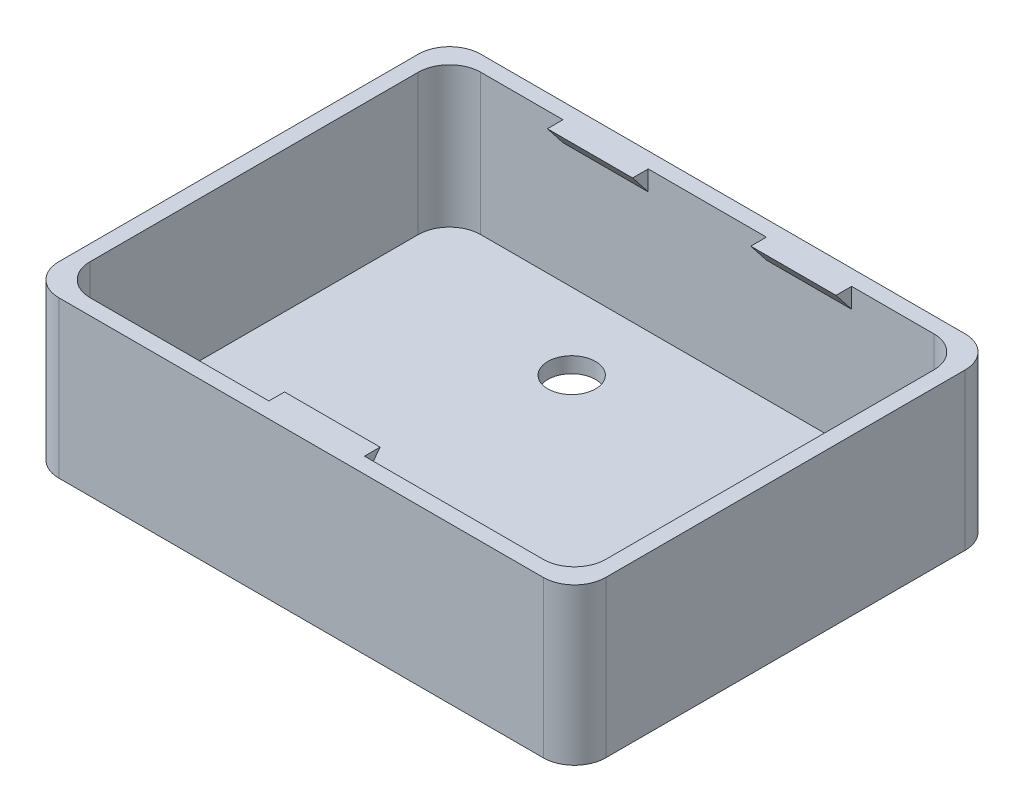
ISO-10303-21;
HEADER;
FILE_DESCRIPTION(('STEP AP214'),'2;1');
FILE_NAME('part.step','',(''),(''),'','','');
FILE_SCHEMA(('AUTOMOTIVE_DESIGN { 1 0 10303 214 1 1 1 1 }'));
ENDSEC;
DATA;
#1=APPLICATION_CONTEXT('core data for automotive mechanical design processes');
#2=APPLICATION_PROTOCOL_DEFINITION('international standard','automotive_design',2000,#1);
#3=PRODUCT_CONTEXT('',#1,'mechanical');
#4=PRODUCT('Part','Part','',(#3));
#5=PRODUCT_RELATED_PRODUCT_CATEGORY('part','',(#4));
#6=PRODUCT_DEFINITION_FORMATION('','',#4);
#7=PRODUCT_DEFINITION_CONTEXT('part definition',#1,'design');
#8=PRODUCT_DEFINITION('design','',#6,#7);
#9=PRODUCT_DEFINITION_SHAPE('','',#8);
#10=(LENGTH_UNIT() NAMED_UNIT(*) SI_UNIT(.MILLI.,.METRE.));
#11=(NAMED_UNIT(*) PLANE_ANGLE_UNIT() SI_UNIT($,.RADIAN.));
#12=(NAMED_UNIT(*) SI_UNIT($,.STERADIAN.) SOLID_ANGLE_UNIT());
#13=UNCERTAINTY_MEASURE_WITH_UNIT(LENGTH_MEASURE(1.E-05),#10,'distance_accuracy_value','');
#14=(GEOMETRIC_REPRESENTATION_CONTEXT(3) GLOBAL_UNCERTAINTY_ASSIGNED_CONTEXT((#13)) GLOBAL_UNIT_ASSIGNED_CONTEXT((#10,
#11,#12)) REPRESENTATION_CONTEXT('',''));
#15=CARTESIAN_POINT('',(0.,0.,0.));
#16=DIRECTION('',(0.,0.,1.));
#17=DIRECTION('',(1.,0.,0.));
#18=AXIS2_PLACEMENT_3D('',#15,#16,#17);
#19=CARTESIAN_POINT('',(16.5,1.,-12.5));
#20=DIRECTION('',(0.,0.,-1.));
#21=DIRECTION('',(-1.,0.,0.));
#22=AXIS2_PLACEMENT_3D('',#19,#20,#21);
#23=PLANE('',#22);
#24=DIRECTION('',(-1.,0.,0.));
#25=VECTOR('',#24,1.);
#26=CARTESIAN_POINT('',(16.5,10.,-12.5));
#27=LINE('',#26,#25);
#28=CARTESIAN_POINT('',(-9.23520923520924,10.,-12.5));
#29=VERTEX_POINT('',#28);
#30=CARTESIAN_POINT('',(-14.5,10.,-12.5));
#31=VERTEX_POINT('',#30);
#32=EDGE_CURVE('E275',#29,#31,#27,.T.);
#33=ORIENTED_EDGE('',*,*,#32,.T.);
#34=DIRECTION('',(0.,1.,0.));
#35=VECTOR('',#34,1.);
#36=CARTESIAN_POINT('',(-14.5,1.,-12.5));
#37=LINE('',#36,#35);
#38=CARTESIAN_POINT('',(-14.5,1.,-12.5));
#39=VERTEX_POINT('',#38);
#40=EDGE_CURVE('E372',#31,#39,#37,.F.);
#41=ORIENTED_EDGE('',*,*,#40,.T.);
#42=DIRECTION('',(-1.,0.,0.));
#43=VECTOR('',#42,1.);
#44=CARTESIAN_POINT('',(16.5,1.,-12.5));
#45=LINE('',#44,#43);
#46=CARTESIAN_POINT('',(14.5,1.,-12.5));
#47=VERTEX_POINT('',#46);
#48=EDGE_CURVE('E259',#47,#39,#45,.T.);
#49=ORIENTED_EDGE('',*,*,#48,.F.);
#50=DIRECTION('',(0.,1.,0.));
#51=VECTOR('',#50,1.);
#52=CARTESIAN_POINT('',(14.5,10.,-12.5));
#53=LINE('',#52,#51);
#54=CARTESIAN_POINT('',(14.5,10.,-12.5));
#55=VERTEX_POINT('',#54);
#56=EDGE_CURVE('E368',#47,#55,#53,.T.);
#57=ORIENTED_EDGE('',*,*,#56,.T.);
#58=CARTESIAN_POINT('',(9.23520923520924,10.,-12.5));
#59=VERTEX_POINT('',#58);
#60=EDGE_CURVE('E251',#55,#59,#27,.T.);
#61=ORIENTED_EDGE('',*,*,#60,.T.);
#62=DIRECTION('',(0.,1.,0.));
#63=VECTOR('',#62,1.);
#64=CARTESIAN_POINT('',(9.23520923520923,10.,-12.5));
#65=LINE('',#64,#63);
#66=CARTESIAN_POINT('',(9.23520923520924,8.72680687641311,-12.5));
#67=VERTEX_POINT('',#66);
#68=EDGE_CURVE('E461',#67,#59,#65,.T.);
#69=ORIENTED_EDGE('',*,*,#68,.F.);
#70=DIRECTION('',(1.,0.,0.));
#71=VECTOR('',#70,1.);
#72=CARTESIAN_POINT('',(9.23520923520924,8.72680687641311,-12.5));
#73=LINE('',#72,#71);
#74=CARTESIAN_POINT('',(3.78134551362898,8.72680687641309,-12.5));
#75=VERTEX_POINT('',#74);
#76=EDGE_CURVE('E472',#75,#67,#73,.T.);
#77=ORIENTED_EDGE('',*,*,#76,.F.);
#78=DIRECTION('',(0.,-1.,0.));
#79=VECTOR('',#78,1.);
#80=CARTESIAN_POINT('',(3.78134551362898,10.,-12.5));
#81=LINE('',#80,#79);
#82=CARTESIAN_POINT('',(3.78134551362898,10.,-12.5));
#83=VERTEX_POINT('',#82);
#84=EDGE_CURVE('E476',#83,#75,#81,.T.);
#85=ORIENTED_EDGE('',*,*,#84,.F.);
#86=CARTESIAN_POINT('',(-3.78134551362898,10.,-12.5));
#87=VERTEX_POINT('',#86);
#88=EDGE_CURVE('E231',#83,#87,#27,.T.);
#89=ORIENTED_EDGE('',*,*,#88,.T.);
#90=DIRECTION('',(0.,1.,0.));
#91=VECTOR('',#90,1.);
#92=CARTESIAN_POINT('',(-3.78134551362898,10.,-12.5));
#93=LINE('',#92,#91);
#94=CARTESIAN_POINT('',(-3.78134551362898,8.72680687641309,-12.5));
#95=VERTEX_POINT('',#94);
#96=EDGE_CURVE('E217',#95,#87,#93,.T.);
#97=ORIENTED_EDGE('',*,*,#96,.F.);
#98=DIRECTION('',(1.,0.,0.));
#99=VECTOR('',#98,1.);
#100=CARTESIAN_POINT('',(-9.23520923520924,8.72680687641309,-12.5));
#101=LINE('',#100,#99);
#102=CARTESIAN_POINT('',(-9.23520923520924,8.72680687641309,-12.5));
#103=VERTEX_POINT('',#102);
#104=EDGE_CURVE('E205',#103,#95,#101,.T.);
#105=ORIENTED_EDGE('',*,*,#104,.F.);
#106=DIRECTION('',(0.,-1.,0.));
#107=VECTOR('',#106,1.);
#108=CARTESIAN_POINT('',(-9.23520923520924,10.,-12.5));
#109=LINE('',#108,#107);
#110=EDGE_CURVE('E218',#29,#103,#109,.T.);
#111=ORIENTED_EDGE('',*,*,#110,.F.);
#112=EDGE_LOOP('',(#33,#41,#49,#57,#61,#69,#77,#85,#89,#97,#105,#111));
#113=FACE_BOUND('',#112,.T.);
#114=ADVANCED_FACE('F39',(#113),#23,.F.);
#115=CARTESIAN_POINT('',(-17.5,10.,13.5));
#116=DIRECTION('',(1.,0.,0.));
#117=DIRECTION('',(0.,0.,-1.));
#118=AXIS2_PLACEMENT_3D('',#115,#116,#117);
#119=PLANE('',#118);
#120=DIRECTION('',(0.,0.,1.));
#121=VECTOR('',#120,1.);
#122=CARTESIAN_POINT('',(-17.5,0.,13.5));
#123=LINE('',#122,#121);
#124=CARTESIAN_POINT('',(-17.5,0.,-11.5));
#125=VERTEX_POINT('',#124);
#126=CARTESIAN_POINT('',(-17.5,0.,11.5));
#127=VERTEX_POINT('',#126);
#128=EDGE_CURVE('E263',#125,#127,#123,.T.);
#129=ORIENTED_EDGE('',*,*,#128,.T.);
#130=DIRECTION('',(0.,-1.,0.));
#131=VECTOR('',#130,1.);
#132=CARTESIAN_POINT('',(-17.5,10.,11.5));
#133=LINE('',#132,#131);
#134=CARTESIAN_POINT('',(-17.5,10.,11.5));
#135=VERTEX_POINT('',#134);
#136=EDGE_CURVE('E358',#127,#135,#133,.F.);
#137=ORIENTED_EDGE('',*,*,#136,.T.);
#138=DIRECTION('',(0.,0.,1.));
#139=VECTOR('',#138,1.);
#140=CARTESIAN_POINT('',(-17.5,10.,13.5));
#141=LINE('',#140,#139);
#142=CARTESIAN_POINT('',(-17.5,10.,-11.5));
#143=VERTEX_POINT('',#142);
#144=EDGE_CURVE('E278',#143,#135,#141,.T.);
#145=ORIENTED_EDGE('',*,*,#144,.F.);
#146=DIRECTION('',(0.,-1.,0.));
#147=VECTOR('',#146,1.);
#148=CARTESIAN_POINT('',(-17.5,10.,-11.5));
#149=LINE('',#148,#147);
#150=EDGE_CURVE('E354',#143,#125,#149,.T.);
#151=ORIENTED_EDGE('',*,*,#150,.T.);
#152=EDGE_LOOP('',(#129,#137,#145,#151));
#153=FACE_BOUND('',#152,.T.);
#154=ADVANCED_FACE('F534',(#153),#119,.F.);
#155=CARTESIAN_POINT('',(17.5,10.,13.5));
#156=DIRECTION('',(0.,0.,-1.));
#157=DIRECTION('',(-1.,0.,0.));
#158=AXIS2_PLACEMENT_3D('',#155,#156,#157);
#159=PLANE('',#158);
#160=DIRECTION('',(1.,0.,0.));
#161=VECTOR('',#160,1.);
#162=CARTESIAN_POINT('',(17.5,0.,13.5));
#163=LINE('',#162,#161);
#164=CARTESIAN_POINT('',(-15.5,0.,13.5));
#165=VERTEX_POINT('',#164);
#166=CARTESIAN_POINT('',(15.5,0.,13.5));
#167=VERTEX_POINT('',#166);
#168=EDGE_CURVE('E299',#165,#167,#163,.T.);
#169=ORIENTED_EDGE('',*,*,#168,.T.);
#170=DIRECTION('',(0.,-1.,0.));
#171=VECTOR('',#170,1.);
#172=CARTESIAN_POINT('',(15.5,10.,13.5));
#173=LINE('',#172,#171);
#174=CARTESIAN_POINT('',(15.5,10.,13.5));
#175=VERTEX_POINT('',#174);
#176=EDGE_CURVE('E351',#167,#175,#173,.F.);
#177=ORIENTED_EDGE('',*,*,#176,.T.);
#178=DIRECTION('',(1.,0.,0.));
#179=VECTOR('',#178,1.);
#180=CARTESIAN_POINT('',(17.5,10.,13.5));
#181=LINE('',#180,#179);
#182=CARTESIAN_POINT('',(-15.5,10.,13.5));
#183=VERTEX_POINT('',#182);
#184=EDGE_CURVE('E282',#183,#175,#181,.T.);
#185=ORIENTED_EDGE('',*,*,#184,.F.);
#186=DIRECTION('',(0.,-1.,0.));
#187=VECTOR('',#186,1.);
#188=CARTESIAN_POINT('',(-15.5,10.,13.5));
#189=LINE('',#188,#187);
#190=EDGE_CURVE('E347',#183,#165,#189,.T.);
#191=ORIENTED_EDGE('',*,*,#190,.T.);
#192=EDGE_LOOP('',(#169,#177,#185,#191));
#193=FACE_BOUND('',#192,.T.);
#194=ADVANCED_FACE('F539',(#193),#159,.F.);
#195=CARTESIAN_POINT('',(17.5,10.,13.5));
#196=DIRECTION('',(-1.,0.,0.));
#197=DIRECTION('',(0.,0.,1.));
#198=AXIS2_PLACEMENT_3D('',#195,#196,#197);
#199=PLANE('',#198);
#200=DIRECTION('',(0.,0.,-1.));
#201=VECTOR('',#200,1.);
#202=CARTESIAN_POINT('',(17.5,0.,13.5));
#203=LINE('',#202,#201);
#204=CARTESIAN_POINT('',(17.5,0.,11.5));
#205=VERTEX_POINT('',#204);
#206=CARTESIAN_POINT('',(17.5,0.,-11.5));
#207=VERTEX_POINT('',#206);
#208=EDGE_CURVE('E303',#205,#207,#203,.T.);
#209=ORIENTED_EDGE('',*,*,#208,.T.);
#210=DIRECTION('',(0.,-1.,0.));
#211=VECTOR('',#210,1.);
#212=CARTESIAN_POINT('',(17.5,10.,-11.5));
#213=LINE('',#212,#211);
#214=CARTESIAN_POINT('',(17.5,10.,-11.5));
#215=VERTEX_POINT('',#214);
#216=EDGE_CURVE('E332',#207,#215,#213,.F.);
#217=ORIENTED_EDGE('',*,*,#216,.T.);
#218=DIRECTION('',(0.,0.,-1.));
#219=VECTOR('',#218,1.);
#220=CARTESIAN_POINT('',(17.5,10.,13.5));
#221=LINE('',#220,#219);
#222=CARTESIAN_POINT('',(17.5,10.,11.5));
#223=VERTEX_POINT('',#222);
#224=EDGE_CURVE('E287',#223,#215,#221,.T.);
#225=ORIENTED_EDGE('',*,*,#224,.F.);
#226=DIRECTION('',(0.,-1.,0.));
#227=VECTOR('',#226,1.);
#228=CARTESIAN_POINT('',(17.5,10.,11.5));
#229=LINE('',#228,#227);
#230=EDGE_CURVE('E328',#223,#205,#229,.T.);
#231=ORIENTED_EDGE('',*,*,#230,.T.);
#232=EDGE_LOOP('',(#209,#217,#225,#231));
#233=FACE_BOUND('',#232,.T.);
#234=ADVANCED_FACE('F560',(#233),#199,.F.);
#235=CARTESIAN_POINT('',(17.5,10.,-13.5));
#236=DIRECTION('',(0.,0.,1.));
#237=DIRECTION('',(1.,0.,0.));
#238=AXIS2_PLACEMENT_3D('',#235,#236,#237);
#239=PLANE('',#238);
#240=DIRECTION('',(-1.,0.,0.));
#241=VECTOR('',#240,1.);
#242=CARTESIAN_POINT('',(17.5,10.,-13.5));
#243=LINE('',#242,#241);
#244=CARTESIAN_POINT('',(15.5,10.,-13.5));
#245=VERTEX_POINT('',#244);
#246=CARTESIAN_POINT('',(-15.5,10.,-13.5));
#247=VERTEX_POINT('',#246);
#248=EDGE_CURVE('E291',#245,#247,#243,.T.);
#249=ORIENTED_EDGE('',*,*,#248,.F.);
#250=DIRECTION('',(0.,-1.,0.));
#251=VECTOR('',#250,1.);
#252=CARTESIAN_POINT('',(15.5,10.,-13.5));
#253=LINE('',#252,#251);
#254=CARTESIAN_POINT('',(15.5,0.,-13.5));
#255=VERTEX_POINT('',#254);
#256=EDGE_CURVE('E312',#245,#255,#253,.T.);
#257=ORIENTED_EDGE('',*,*,#256,.T.);
#258=DIRECTION('',(-1.,0.,0.));
#259=VECTOR('',#258,1.);
#260=CARTESIAN_POINT('',(17.5,0.,-13.5));
#261=LINE('',#260,#259);
#262=CARTESIAN_POINT('',(-15.5,0.,-13.5));
#263=VERTEX_POINT('',#262);
#264=EDGE_CURVE('E283',#255,#263,#261,.T.);
#265=ORIENTED_EDGE('',*,*,#264,.T.);
#266=DIRECTION('',(0.,-1.,0.));
#267=VECTOR('',#266,1.);
#268=CARTESIAN_POINT('',(-15.5,10.,-13.5));
#269=LINE('',#268,#267);
#270=EDGE_CURVE('E295',#263,#247,#269,.F.);
#271=ORIENTED_EDGE('',*,*,#270,.T.);
#272=EDGE_LOOP('',(#249,#257,#265,#271));
#273=FACE_BOUND('',#272,.T.);
#274=ADVANCED_FACE('F554',(#273),#239,.F.);
#275=CARTESIAN_POINT('',(0.,10.,0.));
#276=DIRECTION('',(0.,1.,0.));
#277=DIRECTION('',(0.,0.,1.));
#278=AXIS2_PLACEMENT_3D('',#275,#276,#277);
#279=PLANE('',#278);
#280=DIRECTION('',(0.,0.,1.));
#281=VECTOR('',#280,1.);
#282=CARTESIAN_POINT('',(-16.5,10.,12.5));
#283=LINE('',#282,#281);
#284=CARTESIAN_POINT('',(-16.5,10.,-10.5));
#285=VERTEX_POINT('',#284);
#286=CARTESIAN_POINT('',(-16.5,10.,10.5));
#287=VERTEX_POINT('',#286);
#288=EDGE_CURVE('E245',#285,#287,#283,.T.);
#289=ORIENTED_EDGE('',*,*,#288,.F.);
#290=CARTESIAN_POINT('',(-14.5,10.,-10.5));
#291=DIRECTION('',(0.,1.,0.));
#292=DIRECTION('',(0.,0.,1.));
#293=AXIS2_PLACEMENT_3D('',#290,#291,#292);
#294=CIRCLE('',#293,2.);
#295=EDGE_CURVE('E400',#285,#31,#294,.F.);
#296=ORIENTED_EDGE('',*,*,#295,.T.);
#297=ORIENTED_EDGE('',*,*,#32,.F.);
#298=DIRECTION('',(0.,0.,-1.));
#299=VECTOR('',#298,1.);
#300=CARTESIAN_POINT('',(-9.23520923520924,10.,-11.5));
#301=LINE('',#300,#299);
#302=CARTESIAN_POINT('',(-9.23520923520924,10.,-11.5));
#303=VERTEX_POINT('',#302);
#304=EDGE_CURVE('E236',#303,#29,#301,.T.);
#305=ORIENTED_EDGE('',*,*,#304,.F.);
#306=DIRECTION('',(-1.,0.,0.));
#307=VECTOR('',#306,1.);
#308=CARTESIAN_POINT('',(-9.23520923520924,10.,-11.5));
#309=LINE('',#308,#307);
#310=CARTESIAN_POINT('',(-3.78134551362898,10.,-11.5));
#311=VERTEX_POINT('',#310);
#312=EDGE_CURVE('E233',#311,#303,#309,.T.);
#313=ORIENTED_EDGE('',*,*,#312,.F.);
#314=DIRECTION('',(0.,0.,-1.));
#315=VECTOR('',#314,1.);
#316=CARTESIAN_POINT('',(-3.78134551362898,10.,-11.5));
#317=LINE('',#316,#315);
#318=EDGE_CURVE('E224',#311,#87,#317,.T.);
#319=ORIENTED_EDGE('',*,*,#318,.T.);
#320=ORIENTED_EDGE('',*,*,#88,.F.);
#321=DIRECTION('',(0.,0.,-1.));
#322=VECTOR('',#321,1.);
#323=CARTESIAN_POINT('',(3.78134551362898,10.,-11.5));
#324=LINE('',#323,#322);
#325=CARTESIAN_POINT('',(3.78134551362898,10.,-11.5));
#326=VERTEX_POINT('',#325);
#327=EDGE_CURVE('E471',#326,#83,#324,.T.);
#328=ORIENTED_EDGE('',*,*,#327,.F.);
#329=DIRECTION('',(-1.,0.,0.));
#330=VECTOR('',#329,1.);
#331=CARTESIAN_POINT('',(9.23520923520923,10.,-11.5));
#332=LINE('',#331,#330);
#333=CARTESIAN_POINT('',(9.23520923520923,10.,-11.5));
#334=VERTEX_POINT('',#333);
#335=EDGE_CURVE('E468',#334,#326,#332,.T.);
#336=ORIENTED_EDGE('',*,*,#335,.F.);
#337=DIRECTION('',(0.,0.,-1.));
#338=VECTOR('',#337,1.);
#339=CARTESIAN_POINT('',(9.23520923520923,10.,-11.5));
#340=LINE('',#339,#338);
#341=EDGE_CURVE('E485',#334,#59,#340,.T.);
#342=ORIENTED_EDGE('',*,*,#341,.T.);
#343=ORIENTED_EDGE('',*,*,#60,.F.);
#344=CARTESIAN_POINT('',(14.5,10.,-10.5));
#345=DIRECTION('',(0.,1.,0.));
#346=DIRECTION('',(0.,0.,1.));
#347=AXIS2_PLACEMENT_3D('',#344,#345,#346);
#348=CIRCLE('',#347,2.);
#349=CARTESIAN_POINT('',(16.5,10.,-10.5));
#350=VERTEX_POINT('',#349);
#351=EDGE_CURVE('E403',#55,#350,#348,.F.);
#352=ORIENTED_EDGE('',*,*,#351,.T.);
#353=DIRECTION('',(0.,0.,-1.));
#354=VECTOR('',#353,1.);
#355=CARTESIAN_POINT('',(16.5,10.,12.5));
#356=LINE('',#355,#354);
#357=CARTESIAN_POINT('',(16.5,10.,10.5));
#358=VERTEX_POINT('',#357);
#359=EDGE_CURVE('E271',#358,#350,#356,.T.);
#360=ORIENTED_EDGE('',*,*,#359,.F.);
#361=CARTESIAN_POINT('',(14.5,10.,10.5));
#362=DIRECTION('',(0.,1.,0.));
#363=DIRECTION('',(0.,0.,1.));
#364=AXIS2_PLACEMENT_3D('',#361,#362,#363);
#365=CIRCLE('',#364,2.);
#366=CARTESIAN_POINT('',(14.5,10.,12.5));
#367=VERTEX_POINT('',#366);
#368=EDGE_CURVE('E48',#358,#367,#365,.F.);
#369=ORIENTED_EDGE('',*,*,#368,.T.);
#370=DIRECTION('',(1.,0.,0.));
#371=VECTOR('',#370,1.);
#372=CARTESIAN_POINT('',(16.5,10.,12.5));
#373=LINE('',#372,#371);
#374=CARTESIAN_POINT('',(3.05846983733664,10.,12.5));
#375=VERTEX_POINT('',#374);
#376=EDGE_CURVE('E267',#375,#367,#373,.T.);
#377=ORIENTED_EDGE('',*,*,#376,.F.);
#378=DIRECTION('',(0.,0.,1.));
#379=VECTOR('',#378,1.);
#380=CARTESIAN_POINT('',(3.05846983733664,10.,11.5));
#381=LINE('',#380,#379);
#382=CARTESIAN_POINT('',(3.05846983733664,10.,11.5));
#383=VERTEX_POINT('',#382);
#384=EDGE_CURVE('E457',#383,#375,#381,.T.);
#385=ORIENTED_EDGE('',*,*,#384,.F.);
#386=DIRECTION('',(1.,0.,0.));
#387=VECTOR('',#386,1.);
#388=CARTESIAN_POINT('',(-3.05846983733664,10.,11.5));
#389=LINE('',#388,#387);
#390=CARTESIAN_POINT('',(-3.05846983733664,10.,11.5));
#391=VERTEX_POINT('',#390);
#392=EDGE_CURVE('E453',#391,#383,#389,.T.);
#393=ORIENTED_EDGE('',*,*,#392,.F.);
#394=DIRECTION('',(0.,0.,1.));
#395=VECTOR('',#394,1.);
#396=CARTESIAN_POINT('',(-3.05846983733664,10.,11.5));
#397=LINE('',#396,#395);
#398=CARTESIAN_POINT('',(-3.05846983733664,10.,12.5));
#399=VERTEX_POINT('',#398);
#400=EDGE_CURVE('E452',#391,#399,#397,.T.);
#401=ORIENTED_EDGE('',*,*,#400,.T.);
#402=CARTESIAN_POINT('',(-14.5,10.,12.5));
#403=VERTEX_POINT('',#402);
#404=EDGE_CURVE('E268',#403,#399,#373,.T.);
#405=ORIENTED_EDGE('',*,*,#404,.F.);
#406=CARTESIAN_POINT('',(-14.5,10.,10.5));
#407=DIRECTION('',(0.,1.,0.));
#408=DIRECTION('',(0.,0.,1.));
#409=AXIS2_PLACEMENT_3D('',#406,#407,#408);
#410=CIRCLE('',#409,2.);
#411=EDGE_CURVE('E11',#403,#287,#410,.F.);
#412=ORIENTED_EDGE('',*,*,#411,.T.);
#413=EDGE_LOOP('',(#289,#296,#297,#305,#313,#319,#320,#328,#336,#342,#343,#352,#360,#369,#377,
#385,#393,#401,#405,#412));
#414=FACE_BOUND('',#413,.T.);
#415=ORIENTED_EDGE('',*,*,#224,.T.);
#416=CARTESIAN_POINT('',(15.5,10.,-11.5));
#417=DIRECTION('',(0.,1.,0.));
#418=DIRECTION('',(0.,0.,1.));
#419=AXIS2_PLACEMENT_3D('',#416,#417,#418);
#420=CIRCLE('',#419,2.);
#421=EDGE_CURVE('E344',#215,#245,#420,.T.);
#422=ORIENTED_EDGE('',*,*,#421,.T.);
#423=ORIENTED_EDGE('',*,*,#248,.T.);
#424=CARTESIAN_POINT('',(-15.5,10.,-11.5));
#425=DIRECTION('',(0.,1.,0.));
#426=DIRECTION('',(0.,0.,1.));
#427=AXIS2_PLACEMENT_3D('',#424,#425,#426);
#428=CIRCLE('',#427,2.);
#429=EDGE_CURVE('E335',#247,#143,#428,.T.);
#430=ORIENTED_EDGE('',*,*,#429,.T.);
#431=ORIENTED_EDGE('',*,*,#144,.T.);
#432=CARTESIAN_POINT('',(-15.5,10.,11.5));
#433=DIRECTION('',(0.,1.,0.));
#434=DIRECTION('',(0.,0.,1.));
#435=AXIS2_PLACEMENT_3D('',#432,#433,#434);
#436=CIRCLE('',#435,2.);
#437=EDGE_CURVE('E338',#135,#183,#436,.T.);
#438=ORIENTED_EDGE('',*,*,#437,.T.);
#439=ORIENTED_EDGE('',*,*,#184,.T.);
#440=CARTESIAN_POINT('',(15.5,10.,11.5));
#441=DIRECTION('',(0.,1.,0.));
#442=DIRECTION('',(0.,0.,1.));
#443=AXIS2_PLACEMENT_3D('',#440,#441,#442);
#444=CIRCLE('',#443,2.);
#445=EDGE_CURVE('E341',#175,#223,#444,.T.);
#446=ORIENTED_EDGE('',*,*,#445,.T.);
#447=EDGE_LOOP('',(#415,#422,#423,#430,#431,#438,#439,#446));
#448=FACE_BOUND('',#447,.T.);
#449=ADVANCED_FACE('F448',(#414,#448),#279,.T.);
#450=CARTESIAN_POINT('',(0.,0.,0.));
#451=DIRECTION('',(0.,1.,0.));
#452=DIRECTION('',(0.,0.,1.));
#453=AXIS2_PLACEMENT_3D('',#450,#451,#452);
#454=PLANE('',#453);
#455=CARTESIAN_POINT('',(-3.8,0.,7.62));
#456=DIRECTION('',(0.,1.,0.));
#457=DIRECTION('',(0.,0.,1.));
#458=AXIS2_PLACEMENT_3D('',#455,#456,#457);
#459=CIRCLE('',#458,1.524);
#460=CARTESIAN_POINT('',(-3.8,0.,9.144));
#461=VERTEX_POINT('',#460);
#462=EDGE_CURVE('E227',#461,#461,#459,.T.);
#463=ORIENTED_EDGE('',*,*,#462,.T.);
#464=EDGE_LOOP('',(#463));
#465=FACE_BOUND('',#464,.T.);
#466=CARTESIAN_POINT('',(-3.8,0.,-7.62));
#467=DIRECTION('',(0.,1.,0.));
#468=DIRECTION('',(0.,0.,1.));
#469=AXIS2_PLACEMENT_3D('',#466,#467,#468);
#470=CIRCLE('',#469,1.524);
#471=CARTESIAN_POINT('',(-3.8,0.,-6.096));
#472=VERTEX_POINT('',#471);
#473=EDGE_CURVE('E810',#472,#472,#470,.T.);
#474=ORIENTED_EDGE('',*,*,#473,.T.);
#475=EDGE_LOOP('',(#474));
#476=FACE_BOUND('',#475,.T.);
#477=ORIENTED_EDGE('',*,*,#264,.F.);
#478=CARTESIAN_POINT('',(15.5,0.,-11.5));
#479=DIRECTION('',(0.,1.,0.));
#480=DIRECTION('',(0.,0.,1.));
#481=AXIS2_PLACEMENT_3D('',#478,#479,#480);
#482=CIRCLE('',#481,2.);
#483=EDGE_CURVE('E325',#255,#207,#482,.F.);
#484=ORIENTED_EDGE('',*,*,#483,.T.);
#485=ORIENTED_EDGE('',*,*,#208,.F.);
#486=CARTESIAN_POINT('',(15.5,0.,11.5));
#487=DIRECTION('',(0.,1.,0.));
#488=DIRECTION('',(0.,0.,1.));
#489=AXIS2_PLACEMENT_3D('',#486,#487,#488);
#490=CIRCLE('',#489,2.);
#491=EDGE_CURVE('E322',#205,#167,#490,.F.);
#492=ORIENTED_EDGE('',*,*,#491,.T.);
#493=ORIENTED_EDGE('',*,*,#168,.F.);
#494=CARTESIAN_POINT('',(-15.5,0.,11.5));
#495=DIRECTION('',(0.,1.,0.));
#496=DIRECTION('',(0.,0.,1.));
#497=AXIS2_PLACEMENT_3D('',#494,#495,#496);
#498=CIRCLE('',#497,2.);
#499=EDGE_CURVE('E319',#165,#127,#498,.F.);
#500=ORIENTED_EDGE('',*,*,#499,.T.);
#501=ORIENTED_EDGE('',*,*,#128,.F.);
#502=CARTESIAN_POINT('',(-15.5,0.,-11.5));
#503=DIRECTION('',(0.,1.,0.));
#504=DIRECTION('',(0.,0.,1.));
#505=AXIS2_PLACEMENT_3D('',#502,#503,#504);
#506=CIRCLE('',#505,2.);
#507=EDGE_CURVE('E316',#125,#263,#506,.F.);
#508=ORIENTED_EDGE('',*,*,#507,.T.);
#509=EDGE_LOOP('',(#477,#484,#485,#492,#493,#500,#501,#508));
#510=FACE_BOUND('',#509,.T.);
#511=ADVANCED_FACE('F551',(#465,#476,#510),#454,.F.);
#512=CARTESIAN_POINT('',(-16.5,1.,12.5));
#513=DIRECTION('',(-1.,0.,0.));
#514=DIRECTION('',(0.,0.,1.));
#515=AXIS2_PLACEMENT_3D('',#512,#513,#514);
#516=PLANE('',#515);
#517=DIRECTION('',(0.,0.,1.));
#518=VECTOR('',#517,1.);
#519=CARTESIAN_POINT('',(-16.5,1.,12.5));
#520=LINE('',#519,#518);
#521=CARTESIAN_POINT('',(-16.5,1.,-10.5));
#522=VERTEX_POINT('',#521);
#523=CARTESIAN_POINT('',(-16.5,1.,10.5));
#524=VERTEX_POINT('',#523);
#525=EDGE_CURVE('E246',#522,#524,#520,.T.);
#526=ORIENTED_EDGE('',*,*,#525,.F.);
#527=DIRECTION('',(0.,1.,0.));
#528=VECTOR('',#527,1.);
#529=CARTESIAN_POINT('',(-16.5,10.,-10.5));
#530=LINE('',#529,#528);
#531=EDGE_CURVE('E364',#522,#285,#530,.T.);
#532=ORIENTED_EDGE('',*,*,#531,.T.);
#533=ORIENTED_EDGE('',*,*,#288,.T.);
#534=DIRECTION('',(0.,1.,0.));
#535=VECTOR('',#534,1.);
#536=CARTESIAN_POINT('',(-16.5,1.,10.5));
#537=LINE('',#536,#535);
#538=EDGE_CURVE('E361',#287,#524,#537,.F.);
#539=ORIENTED_EDGE('',*,*,#538,.T.);
#540=EDGE_LOOP('',(#526,#532,#533,#539));
#541=FACE_BOUND('',#540,.T.);
#542=ADVANCED_FACE('F442',(#541),#516,.F.);
#543=CARTESIAN_POINT('',(16.5,1.,12.5));
#544=DIRECTION('',(1.,0.,0.));
#545=DIRECTION('',(0.,0.,-1.));
#546=AXIS2_PLACEMENT_3D('',#543,#544,#545);
#547=PLANE('',#546);
#548=ORIENTED_EDGE('',*,*,#359,.T.);
#549=DIRECTION('',(0.,1.,0.));
#550=VECTOR('',#549,1.);
#551=CARTESIAN_POINT('',(16.5,1.,-10.5));
#552=LINE('',#551,#550);
#553=CARTESIAN_POINT('',(16.5,1.,-10.5));
#554=VERTEX_POINT('',#553);
#555=EDGE_CURVE('E391',#350,#554,#552,.F.);
#556=ORIENTED_EDGE('',*,*,#555,.T.);
#557=DIRECTION('',(0.,0.,-1.));
#558=VECTOR('',#557,1.);
#559=CARTESIAN_POINT('',(16.5,1.,12.5));
#560=LINE('',#559,#558);
#561=CARTESIAN_POINT('',(16.5,1.,10.5));
#562=VERTEX_POINT('',#561);
#563=EDGE_CURVE('E255',#562,#554,#560,.T.);
#564=ORIENTED_EDGE('',*,*,#563,.F.);
#565=DIRECTION('',(0.,1.,0.));
#566=VECTOR('',#565,1.);
#567=CARTESIAN_POINT('',(16.5,10.,10.5));
#568=LINE('',#567,#566);
#569=EDGE_CURVE('E387',#562,#358,#568,.T.);
#570=ORIENTED_EDGE('',*,*,#569,.T.);
#571=EDGE_LOOP('',(#548,#556,#564,#570));
#572=FACE_BOUND('',#571,.T.);
#573=ADVANCED_FACE('F427',(#572),#547,.F.);
#574=CARTESIAN_POINT('',(16.5,1.,12.5));
#575=DIRECTION('',(0.,0.,1.));
#576=DIRECTION('',(1.,0.,0.));
#577=AXIS2_PLACEMENT_3D('',#574,#575,#576);
#578=PLANE('',#577);
#579=ORIENTED_EDGE('',*,*,#376,.T.);
#580=DIRECTION('',(0.,1.,0.));
#581=VECTOR('',#580,1.);
#582=CARTESIAN_POINT('',(14.5,1.,12.5));
#583=LINE('',#582,#581);
#584=CARTESIAN_POINT('',(14.5,1.,12.5));
#585=VERTEX_POINT('',#584);
#586=EDGE_CURVE('E397',#367,#585,#583,.F.);
#587=ORIENTED_EDGE('',*,*,#586,.T.);
#588=DIRECTION('',(1.,0.,0.));
#589=VECTOR('',#588,1.);
#590=CARTESIAN_POINT('',(16.5,1.,12.5));
#591=LINE('',#590,#589);
#592=CARTESIAN_POINT('',(-14.5,1.,12.5));
#593=VERTEX_POINT('',#592);
#594=EDGE_CURVE('E250',#593,#585,#591,.T.);
#595=ORIENTED_EDGE('',*,*,#594,.F.);
#596=DIRECTION('',(0.,1.,0.));
#597=VECTOR('',#596,1.);
#598=CARTESIAN_POINT('',(-14.5,10.,12.5));
#599=LINE('',#598,#597);
#600=EDGE_CURVE('E394',#593,#403,#599,.T.);
#601=ORIENTED_EDGE('',*,*,#600,.T.);
#602=ORIENTED_EDGE('',*,*,#404,.T.);
#603=DIRECTION('',(0.,1.,0.));
#604=VECTOR('',#603,1.);
#605=CARTESIAN_POINT('',(-3.05846983733664,8.67337191213878,12.5));
#606=LINE('',#605,#604);
#607=CARTESIAN_POINT('',(-3.05846983733664,8.67337191213878,12.5));
#608=VERTEX_POINT('',#607);
#609=EDGE_CURVE('E463',#608,#399,#606,.T.);
#610=ORIENTED_EDGE('',*,*,#609,.F.);
#611=DIRECTION('',(1.,0.,0.));
#612=VECTOR('',#611,1.);
#613=CARTESIAN_POINT('',(-3.05846983733664,8.67337191213878,12.5));
#614=LINE('',#613,#612);
#615=CARTESIAN_POINT('',(3.05846983733664,8.67337191213878,12.5));
#616=VERTEX_POINT('',#615);
#617=EDGE_CURVE('E515',#608,#616,#614,.T.);
#618=ORIENTED_EDGE('',*,*,#617,.T.);
#619=DIRECTION('',(0.,1.,0.));
#620=VECTOR('',#619,1.);
#621=CARTESIAN_POINT('',(3.05846983733664,8.67337191213878,12.5));
#622=LINE('',#621,#620);
#623=EDGE_CURVE('E415',#616,#375,#622,.T.);
#624=ORIENTED_EDGE('',*,*,#623,.T.);
#625=EDGE_LOOP('',(#579,#587,#595,#601,#602,#610,#618,#624));
#626=FACE_BOUND('',#625,.T.);
#627=ADVANCED_FACE('F411',(#626),#578,.F.);
#628=CARTESIAN_POINT('',(0.,1.,0.));
#629=DIRECTION('',(0.,1.,0.));
#630=DIRECTION('',(0.,0.,1.));
#631=AXIS2_PLACEMENT_3D('',#628,#629,#630);
#632=PLANE('',#631);
#633=CARTESIAN_POINT('',(-3.8,1.,7.62));
#634=DIRECTION('',(0.,1.,0.));
#635=DIRECTION('',(0.,0.,1.));
#636=AXIS2_PLACEMENT_3D('',#633,#634,#635);
#637=CIRCLE('',#636,1.524);
#638=CARTESIAN_POINT('',(-3.8,1.,9.144));
#639=VERTEX_POINT('',#638);
#640=EDGE_CURVE('E804',#639,#639,#637,.T.);
#641=ORIENTED_EDGE('',*,*,#640,.F.);
#642=EDGE_LOOP('',(#641));
#643=FACE_BOUND('',#642,.T.);
#644=CARTESIAN_POINT('',(-3.8,1.,-7.62));
#645=DIRECTION('',(0.,1.,0.));
#646=DIRECTION('',(0.,0.,-1.));
#647=AXIS2_PLACEMENT_3D('',#644,#645,#646);
#648=CIRCLE('',#647,1.524);
#649=CARTESIAN_POINT('',(-3.8,1.,-9.144));
#650=VERTEX_POINT('',#649);
#651=EDGE_CURVE('E806',#650,#650,#648,.T.);
#652=ORIENTED_EDGE('',*,*,#651,.F.);
#653=EDGE_LOOP('',(#652));
#654=FACE_BOUND('',#653,.T.);
#655=ORIENTED_EDGE('',*,*,#48,.T.);
#656=CARTESIAN_POINT('',(-14.5,1.,-10.5));
#657=DIRECTION('',(0.,1.,0.));
#658=DIRECTION('',(0.,0.,1.));
#659=AXIS2_PLACEMENT_3D('',#656,#657,#658);
#660=CIRCLE('',#659,2.);
#661=EDGE_CURVE('E384',#39,#522,#660,.T.);
#662=ORIENTED_EDGE('',*,*,#661,.T.);
#663=ORIENTED_EDGE('',*,*,#525,.T.);
#664=CARTESIAN_POINT('',(-14.5,1.,10.5));
#665=DIRECTION('',(0.,1.,0.));
#666=DIRECTION('',(0.,0.,1.));
#667=AXIS2_PLACEMENT_3D('',#664,#665,#666);
#668=CIRCLE('',#667,2.);
#669=EDGE_CURVE('E375',#524,#593,#668,.T.);
#670=ORIENTED_EDGE('',*,*,#669,.T.);
#671=ORIENTED_EDGE('',*,*,#594,.T.);
#672=CARTESIAN_POINT('',(14.5,1.,10.5));
#673=DIRECTION('',(0.,1.,0.));
#674=DIRECTION('',(0.,0.,1.));
#675=AXIS2_PLACEMENT_3D('',#672,#673,#674);
#676=CIRCLE('',#675,2.);
#677=EDGE_CURVE('E378',#585,#562,#676,.T.);
#678=ORIENTED_EDGE('',*,*,#677,.T.);
#679=ORIENTED_EDGE('',*,*,#563,.T.);
#680=CARTESIAN_POINT('',(14.5,1.,-10.5));
#681=DIRECTION('',(0.,1.,0.));
#682=DIRECTION('',(0.,0.,1.));
#683=AXIS2_PLACEMENT_3D('',#680,#681,#682);
#684=CIRCLE('',#683,2.);
#685=EDGE_CURVE('E381',#554,#47,#684,.T.);
#686=ORIENTED_EDGE('',*,*,#685,.T.);
#687=EDGE_LOOP('',(#655,#662,#663,#670,#671,#678,#679,#686));
#688=FACE_BOUND('',#687,.T.);
#689=ADVANCED_FACE('F424',(#643,#654,#688),#632,.T.);
#690=CARTESIAN_POINT('',(-9.23520923520924,10.,-11.5));
#691=DIRECTION('',(1.,0.,0.));
#692=DIRECTION('',(0.,0.,-1.));
#693=AXIS2_PLACEMENT_3D('',#690,#691,#692);
#694=PLANE('',#693);
#695=ORIENTED_EDGE('',*,*,#110,.T.);
#696=DIRECTION('',(0.,0.786428160644937,0.617681753125848));
#697=VECTOR('',#696,1.);
#698=CARTESIAN_POINT('',(-9.23520923520924,10.,-11.5));
#699=LINE('',#698,#697);
#700=EDGE_CURVE('E211',#103,#303,#699,.T.);
#701=ORIENTED_EDGE('',*,*,#700,.T.);
#702=ORIENTED_EDGE('',*,*,#304,.T.);
#703=EDGE_LOOP('',(#695,#701,#702));
#704=FACE_BOUND('',#703,.T.);
#705=ADVANCED_FACE('F490',(#704),#694,.F.);
#706=CARTESIAN_POINT('',(-3.78134551362898,10.,-11.5));
#707=DIRECTION('',(-1.,0.,0.));
#708=DIRECTION('',(0.,0.,1.));
#709=AXIS2_PLACEMENT_3D('',#706,#707,#708);
#710=PLANE('',#709);
#711=ORIENTED_EDGE('',*,*,#318,.F.);
#712=DIRECTION('',(0.,0.786428160644937,0.617681753125848));
#713=VECTOR('',#712,1.);
#714=CARTESIAN_POINT('',(-3.78134551362898,10.,-11.5));
#715=LINE('',#714,#713);
#716=EDGE_CURVE('E208',#95,#311,#715,.T.);
#717=ORIENTED_EDGE('',*,*,#716,.F.);
#718=ORIENTED_EDGE('',*,*,#96,.T.);
#719=EDGE_LOOP('',(#711,#717,#718));
#720=FACE_BOUND('',#719,.T.);
#721=ADVANCED_FACE('F222',(#720),#710,.F.);
#722=CARTESIAN_POINT('',(9.23520923520923,10.,-11.5));
#723=DIRECTION('',(-1.,0.,0.));
#724=DIRECTION('',(0.,-1.,0.));
#725=AXIS2_PLACEMENT_3D('',#722,#723,#724);
#726=PLANE('',#725);
#727=ORIENTED_EDGE('',*,*,#341,.F.);
#728=DIRECTION('',(0.,0.786428160644936,0.617681753125849));
#729=VECTOR('',#728,1.);
#730=CARTESIAN_POINT('',(9.23520923520923,10.,-11.5));
#731=LINE('',#730,#729);
#732=EDGE_CURVE('E503',#67,#334,#731,.T.);
#733=ORIENTED_EDGE('',*,*,#732,.F.);
#734=ORIENTED_EDGE('',*,*,#68,.T.);
#735=EDGE_LOOP('',(#727,#733,#734));
#736=FACE_BOUND('',#735,.T.);
#737=ADVANCED_FACE('F531',(#736),#726,.F.);
#738=CARTESIAN_POINT('',(3.78134551362898,10.,-11.5));
#739=DIRECTION('',(1.,0.,0.));
#740=DIRECTION('',(0.,1.,0.));
#741=AXIS2_PLACEMENT_3D('',#738,#739,#740);
#742=PLANE('',#741);
#743=ORIENTED_EDGE('',*,*,#84,.T.);
#744=DIRECTION('',(0.,0.786428160644936,0.617681753125849));
#745=VECTOR('',#744,1.);
#746=CARTESIAN_POINT('',(3.78134551362898,10.,-11.5));
#747=LINE('',#746,#745);
#748=EDGE_CURVE('E499',#75,#326,#747,.T.);
#749=ORIENTED_EDGE('',*,*,#748,.T.);
#750=ORIENTED_EDGE('',*,*,#327,.T.);
#751=EDGE_LOOP('',(#743,#749,#750));
#752=FACE_BOUND('',#751,.T.);
#753=ADVANCED_FACE('F498',(#752),#742,.F.);
#754=CARTESIAN_POINT('',(3.05846983733664,8.67337191213878,11.5));
#755=DIRECTION('',(1.,0.,0.));
#756=DIRECTION('',(0.,0.,-1.));
#757=AXIS2_PLACEMENT_3D('',#754,#755,#756);
#758=PLANE('',#757);
#759=DIRECTION('',(0.,-0.798544648893133,0.601935581041812));
#760=VECTOR('',#759,1.);
#761=CARTESIAN_POINT('',(3.05846983733664,8.67337191213878,12.5));
#762=LINE('',#761,#760);
#763=EDGE_CURVE('E502',#383,#616,#762,.T.);
#764=ORIENTED_EDGE('',*,*,#763,.F.);
#765=ORIENTED_EDGE('',*,*,#384,.T.);
#766=ORIENTED_EDGE('',*,*,#623,.F.);
#767=EDGE_LOOP('',(#764,#765,#766));
#768=FACE_BOUND('',#767,.T.);
#769=ADVANCED_FACE('F523',(#768),#758,.T.);
#770=CARTESIAN_POINT('',(-3.05846983733664,8.67337191213878,11.5));
#771=DIRECTION('',(1.,0.,0.));
#772=DIRECTION('',(0.,0.,-1.));
#773=AXIS2_PLACEMENT_3D('',#770,#771,#772);
#774=PLANE('',#773);
#775=ORIENTED_EDGE('',*,*,#400,.F.);
#776=DIRECTION('',(0.,-0.798544648893133,0.601935581041812));
#777=VECTOR('',#776,1.);
#778=CARTESIAN_POINT('',(-3.05846983733664,9.1540443493581,12.1376735562759));
#779=LINE('',#778,#777);
#780=EDGE_CURVE('E507',#391,#608,#779,.T.);
#781=ORIENTED_EDGE('',*,*,#780,.T.);
#782=ORIENTED_EDGE('',*,*,#609,.T.);
#783=EDGE_LOOP('',(#775,#781,#782));
#784=FACE_BOUND('',#783,.T.);
#785=ADVANCED_FACE('F518',(#784),#774,.F.);
#786=CARTESIAN_POINT('',(-4.94153016266336,8.67337191213878,12.5));
#787=DIRECTION('',(0.,0.601935581041812,0.798544648893133));
#788=DIRECTION('',(0.,-0.798544648893133,0.601935581041812));
#789=AXIS2_PLACEMENT_3D('',#786,#787,#788);
#790=PLANE('',#789);
#791=ORIENTED_EDGE('',*,*,#392,.T.);
#792=ORIENTED_EDGE('',*,*,#763,.T.);
#793=ORIENTED_EDGE('',*,*,#617,.F.);
#794=ORIENTED_EDGE('',*,*,#780,.F.);
#795=EDGE_LOOP('',(#791,#792,#793,#794));
#796=FACE_BOUND('',#795,.T.);
#797=ADVANCED_FACE('F520',(#796),#790,.F.);
#798=CARTESIAN_POINT('',(1.23520923520923,10.,-11.5));
#799=DIRECTION('',(0.,0.617681753125849,-0.786428160644936));
#800=DIRECTION('',(0.,0.786428160644936,0.617681753125849));
#801=AXIS2_PLACEMENT_3D('',#798,#799,#800);
#802=PLANE('',#801);
#803=ORIENTED_EDGE('',*,*,#76,.T.);
#804=ORIENTED_EDGE('',*,*,#732,.T.);
#805=ORIENTED_EDGE('',*,*,#335,.T.);
#806=ORIENTED_EDGE('',*,*,#748,.F.);
#807=EDGE_LOOP('',(#803,#804,#805,#806));
#808=FACE_BOUND('',#807,.T.);
#809=ADVANCED_FACE('F608',(#808),#802,.F.);
#810=CARTESIAN_POINT('',(-11.781345513629,10.,-11.5));
#811=DIRECTION('',(0.,0.617681753125848,-0.786428160644937));
#812=DIRECTION('',(0.,0.786428160644937,0.617681753125848));
#813=AXIS2_PLACEMENT_3D('',#810,#811,#812);
#814=PLANE('',#813);
#815=ORIENTED_EDGE('',*,*,#104,.T.);
#816=ORIENTED_EDGE('',*,*,#716,.T.);
#817=ORIENTED_EDGE('',*,*,#312,.T.);
#818=ORIENTED_EDGE('',*,*,#700,.F.);
#819=EDGE_LOOP('',(#815,#816,#817,#818));
#820=FACE_BOUND('',#819,.T.);
#821=ADVANCED_FACE('F207',(#820),#814,.F.);
#822=CARTESIAN_POINT('',(15.5,10.,-11.5));
#823=DIRECTION('',(0.,-1.,0.));
#824=DIRECTION('',(0.,0.,-1.));
#825=AXIS2_PLACEMENT_3D('',#822,#823,#824);
#826=CYLINDRICAL_SURFACE('',#825,2.);
#827=ORIENTED_EDGE('',*,*,#421,.F.);
#828=ORIENTED_EDGE('',*,*,#216,.F.);
#829=ORIENTED_EDGE('',*,*,#483,.F.);
#830=ORIENTED_EDGE('',*,*,#256,.F.);
#831=EDGE_LOOP('',(#827,#828,#829,#830));
#832=FACE_BOUND('',#831,.T.);
#833=ADVANCED_FACE('F568',(#832),#826,.T.);
#834=CARTESIAN_POINT('',(15.5,10.,11.5));
#835=DIRECTION('',(0.,-1.,0.));
#836=DIRECTION('',(0.,0.,-1.));
#837=AXIS2_PLACEMENT_3D('',#834,#835,#836);
#838=CYLINDRICAL_SURFACE('',#837,2.);
#839=ORIENTED_EDGE('',*,*,#445,.F.);
#840=ORIENTED_EDGE('',*,*,#176,.F.);
#841=ORIENTED_EDGE('',*,*,#491,.F.);
#842=ORIENTED_EDGE('',*,*,#230,.F.);
#843=EDGE_LOOP('',(#839,#840,#841,#842));
#844=FACE_BOUND('',#843,.T.);
#845=ADVANCED_FACE('F571',(#844),#838,.T.);
#846=CARTESIAN_POINT('',(-15.5,10.,11.5));
#847=DIRECTION('',(0.,-1.,0.));
#848=DIRECTION('',(0.,0.,-1.));
#849=AXIS2_PLACEMENT_3D('',#846,#847,#848);
#850=CYLINDRICAL_SURFACE('',#849,2.);
#851=ORIENTED_EDGE('',*,*,#437,.F.);
#852=ORIENTED_EDGE('',*,*,#136,.F.);
#853=ORIENTED_EDGE('',*,*,#499,.F.);
#854=ORIENTED_EDGE('',*,*,#190,.F.);
#855=EDGE_LOOP('',(#851,#852,#853,#854));
#856=FACE_BOUND('',#855,.T.);
#857=ADVANCED_FACE('F575',(#856),#850,.T.);
#858=CARTESIAN_POINT('',(-15.5,10.,-11.5));
#859=DIRECTION('',(0.,-1.,0.));
#860=DIRECTION('',(0.,0.,-1.));
#861=AXIS2_PLACEMENT_3D('',#858,#859,#860);
#862=CYLINDRICAL_SURFACE('',#861,2.);
#863=ORIENTED_EDGE('',*,*,#429,.F.);
#864=ORIENTED_EDGE('',*,*,#270,.F.);
#865=ORIENTED_EDGE('',*,*,#507,.F.);
#866=ORIENTED_EDGE('',*,*,#150,.F.);
#867=EDGE_LOOP('',(#863,#864,#865,#866));
#868=FACE_BOUND('',#867,.T.);
#869=ADVANCED_FACE('F579',(#868),#862,.T.);
#870=CARTESIAN_POINT('',(-14.5,1.,-10.5));
#871=DIRECTION('',(0.,-1.,0.));
#872=DIRECTION('',(0.,0.,-1.));
#873=AXIS2_PLACEMENT_3D('',#870,#871,#872);
#874=CYLINDRICAL_SURFACE('',#873,2.);
#875=ORIENTED_EDGE('',*,*,#661,.F.);
#876=ORIENTED_EDGE('',*,*,#40,.F.);
#877=ORIENTED_EDGE('',*,*,#295,.F.);
#878=ORIENTED_EDGE('',*,*,#531,.F.);
#879=EDGE_LOOP('',(#875,#876,#877,#878));
#880=FACE_BOUND('',#879,.T.);
#881=ADVANCED_FACE('F437',(#880),#874,.F.);
#882=CARTESIAN_POINT('',(14.5,1.,-10.5));
#883=DIRECTION('',(0.,-1.,0.));
#884=DIRECTION('',(0.,0.,-1.));
#885=AXIS2_PLACEMENT_3D('',#882,#883,#884);
#886=CYLINDRICAL_SURFACE('',#885,2.);
#887=ORIENTED_EDGE('',*,*,#685,.F.);
#888=ORIENTED_EDGE('',*,*,#555,.F.);
#889=ORIENTED_EDGE('',*,*,#351,.F.);
#890=ORIENTED_EDGE('',*,*,#56,.F.);
#891=EDGE_LOOP('',(#887,#888,#889,#890));
#892=FACE_BOUND('',#891,.T.);
#893=ADVANCED_FACE('F430',(#892),#886,.F.);
#894=CARTESIAN_POINT('',(14.5,1.,10.5));
#895=DIRECTION('',(0.,-1.,0.));
#896=DIRECTION('',(0.,0.,-1.));
#897=AXIS2_PLACEMENT_3D('',#894,#895,#896);
#898=CYLINDRICAL_SURFACE('',#897,2.);
#899=ORIENTED_EDGE('',*,*,#677,.F.);
#900=ORIENTED_EDGE('',*,*,#586,.F.);
#901=ORIENTED_EDGE('',*,*,#368,.F.);
#902=ORIENTED_EDGE('',*,*,#569,.F.);
#903=EDGE_LOOP('',(#899,#900,#901,#902));
#904=FACE_BOUND('',#903,.T.);
#905=ADVANCED_FACE('F420',(#904),#898,.F.);
#906=CARTESIAN_POINT('',(-14.5,1.,10.5));
#907=DIRECTION('',(0.,-1.,0.));
#908=DIRECTION('',(0.,0.,-1.));
#909=AXIS2_PLACEMENT_3D('',#906,#907,#908);
#910=CYLINDRICAL_SURFACE('',#909,2.);
#911=ORIENTED_EDGE('',*,*,#669,.F.);
#912=ORIENTED_EDGE('',*,*,#538,.F.);
#913=ORIENTED_EDGE('',*,*,#411,.F.);
#914=ORIENTED_EDGE('',*,*,#600,.F.);
#915=EDGE_LOOP('',(#911,#912,#913,#914));
#916=FACE_BOUND('',#915,.T.);
#917=ADVANCED_FACE('F41',(#916),#910,.F.);
#918=CARTESIAN_POINT('',(-3.8,-7.00000000000001,-7.62));
#919=DIRECTION('',(0.,1.,0.));
#920=DIRECTION('',(0.,0.,1.));
#921=AXIS2_PLACEMENT_3D('',#918,#919,#920);
#922=CYLINDRICAL_SURFACE('',#921,1.524);
#923=ORIENTED_EDGE('',*,*,#651,.T.);
#924=EDGE_LOOP('',(#923));
#925=FACE_BOUND('',#924,.T.);
#926=ORIENTED_EDGE('',*,*,#473,.F.);
#927=EDGE_LOOP('',(#926));
#928=FACE_BOUND('',#927,.T.);
#929=ADVANCED_FACE('F591',(#925,#928),#922,.F.);
#930=CARTESIAN_POINT('',(-3.8,-7.00000000000001,7.62));
#931=DIRECTION('',(0.,1.,0.));
#932=DIRECTION('',(0.,0.,1.));
#933=AXIS2_PLACEMENT_3D('',#930,#931,#932);
#934=CYLINDRICAL_SURFACE('',#933,1.524);
#935=ORIENTED_EDGE('',*,*,#640,.T.);
#936=EDGE_LOOP('',(#935));
#937=FACE_BOUND('',#936,.T.);
#938=ORIENTED_EDGE('',*,*,#462,.F.);
#939=EDGE_LOOP('',(#938));
#940=FACE_BOUND('',#939,.T.);
#941=ADVANCED_FACE('F595',(#937,#940),#934,.F.);
#942=CLOSED_SHELL('',(#114,#154,#194,#234,#274,#449,#511,#542,#573,#627,#689,#705,#721,#737,
#753,#769,#785,#797,#809,#821,#833,#845,#857,#869,#881,#893,#905,#917,#929,#941));
#943=MANIFOLD_SOLID_BREP('B2',#942);
#944=ADVANCED_BREP_SHAPE_REPRESENTATION('',(#18,#943),#14);
#945=SHAPE_DEFINITION_REPRESENTATION(#9,#944);
ENDSEC;
END-ISO-10303-21;
